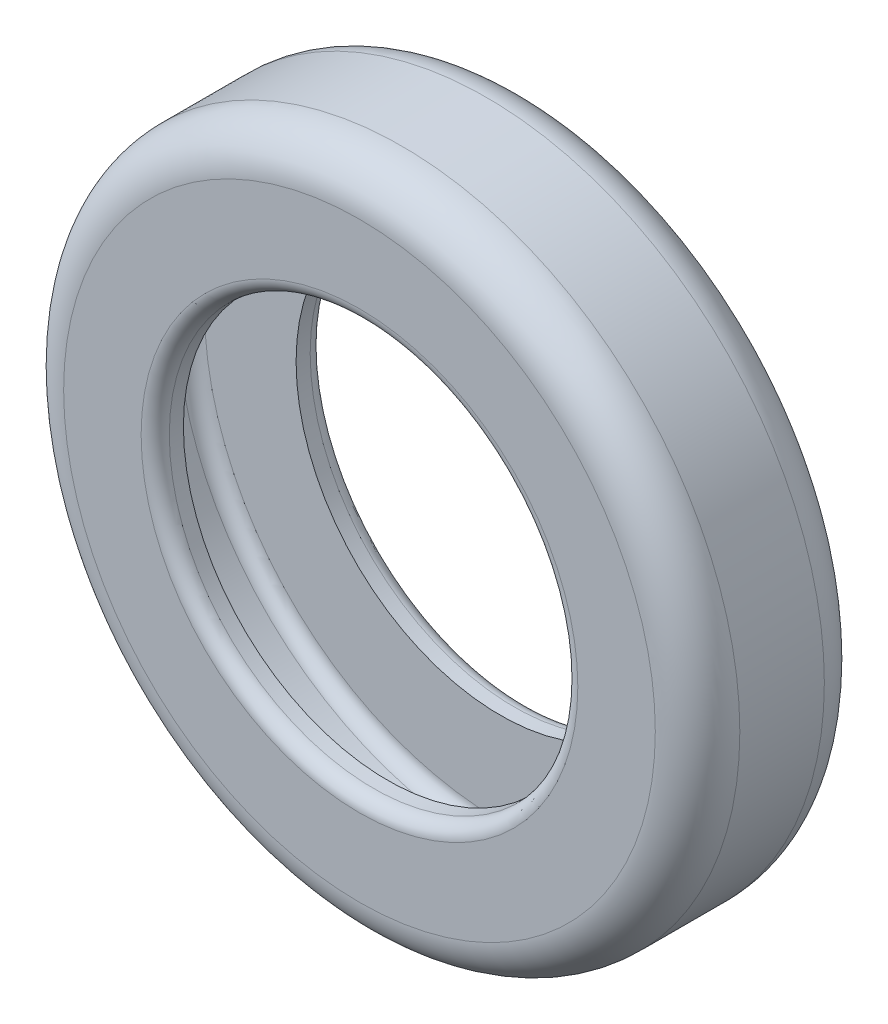
ISO-10303-21;
HEADER;
FILE_DESCRIPTION(('STEP AP214'),'2;1');
FILE_NAME('part.step','',(''),(''),'','','');
FILE_SCHEMA(('AUTOMOTIVE_DESIGN { 1 0 10303 214 1 1 1 1 }'));
ENDSEC;
DATA;
#1=APPLICATION_CONTEXT('core data for automotive mechanical design processes');
#2=APPLICATION_PROTOCOL_DEFINITION('international standard','automotive_design',2000,#1);
#3=PRODUCT_CONTEXT('',#1,'mechanical');
#4=PRODUCT('Part','Part','',(#3));
#5=PRODUCT_RELATED_PRODUCT_CATEGORY('part','',(#4));
#6=PRODUCT_DEFINITION_FORMATION('','',#4);
#7=PRODUCT_DEFINITION_CONTEXT('part definition',#1,'design');
#8=PRODUCT_DEFINITION('design','',#6,#7);
#9=PRODUCT_DEFINITION_SHAPE('','',#8);
#10=(LENGTH_UNIT() NAMED_UNIT(*) SI_UNIT(.MILLI.,.METRE.));
#11=(NAMED_UNIT(*) PLANE_ANGLE_UNIT() SI_UNIT($,.RADIAN.));
#12=(NAMED_UNIT(*) SI_UNIT($,.STERADIAN.) SOLID_ANGLE_UNIT());
#13=UNCERTAINTY_MEASURE_WITH_UNIT(LENGTH_MEASURE(1.E-05),#10,'distance_accuracy_value','');
#14=(GEOMETRIC_REPRESENTATION_CONTEXT(3) GLOBAL_UNCERTAINTY_ASSIGNED_CONTEXT((#13)) GLOBAL_UNIT_ASSIGNED_CONTEXT((#10,
#11,#12)) REPRESENTATION_CONTEXT('',''));
#15=CARTESIAN_POINT('',(0.,0.,0.));
#16=DIRECTION('',(0.,0.,1.));
#17=DIRECTION('',(1.,0.,0.));
#18=AXIS2_PLACEMENT_3D('',#15,#16,#17);
#19=CARTESIAN_POINT('',(0.,0.,-120.));
#20=DIRECTION('',(0.,0.,1.));
#21=DIRECTION('',(1.,0.,0.));
#22=AXIS2_PLACEMENT_3D('',#19,#20,#21);
#23=CYLINDRICAL_SURFACE('',#22,145.);
#24=CARTESIAN_POINT('',(0.,0.,-110.));
#25=DIRECTION('',(0.,0.,1.));
#26=DIRECTION('',(1.,0.,0.));
#27=AXIS2_PLACEMENT_3D('',#24,#25,#26);
#28=CIRCLE('',#27,145.);
#29=CARTESIAN_POINT('',(145.,0.,-110.));
#30=VERTEX_POINT('',#29);
#31=EDGE_CURVE('E11',#30,#30,#28,.F.);
#32=ORIENTED_EDGE('',*,*,#31,.T.);
#33=EDGE_LOOP('',(#32));
#34=FACE_BOUND('',#33,.T.);
#35=CARTESIAN_POINT('',(0.,0.,-100.));
#36=DIRECTION('',(0.,0.,1.));
#37=DIRECTION('',(1.,0.,0.));
#38=AXIS2_PLACEMENT_3D('',#35,#36,#37);
#39=CIRCLE('',#38,145.);
#40=CARTESIAN_POINT('',(145.,0.,-100.));
#41=VERTEX_POINT('',#40);
#42=EDGE_CURVE('E89',#41,#41,#39,.F.);
#43=ORIENTED_EDGE('',*,*,#42,.F.);
#44=EDGE_LOOP('',(#43));
#45=FACE_BOUND('',#44,.T.);
#46=ADVANCED_FACE('F45',(#34,#45),#23,.F.);
#47=CARTESIAN_POINT('',(0.,0.,-120.));
#48=DIRECTION('',(0.,0.,1.));
#49=DIRECTION('',(1.,0.,0.));
#50=AXIS2_PLACEMENT_3D('',#47,#48,#49);
#51=CYLINDRICAL_SURFACE('',#50,240.);
#52=CARTESIAN_POINT('',(0.,0.,-90.));
#53=DIRECTION('',(0.,0.,1.));
#54=DIRECTION('',(1.,0.,0.));
#55=AXIS2_PLACEMENT_3D('',#52,#53,#54);
#56=CIRCLE('',#55,240.);
#57=CARTESIAN_POINT('',(240.,0.,-90.));
#58=VERTEX_POINT('',#57);
#59=EDGE_CURVE('E77',#58,#58,#56,.T.);
#60=ORIENTED_EDGE('',*,*,#59,.T.);
#61=EDGE_LOOP('',(#60));
#62=FACE_BOUND('',#61,.T.);
#63=CARTESIAN_POINT('',(0.,0.,-30.));
#64=DIRECTION('',(0.,0.,1.));
#65=DIRECTION('',(1.,0.,0.));
#66=AXIS2_PLACEMENT_3D('',#63,#64,#65);
#67=CIRCLE('',#66,240.);
#68=CARTESIAN_POINT('',(240.,0.,-30.));
#69=VERTEX_POINT('',#68);
#70=EDGE_CURVE('E81',#69,#69,#67,.F.);
#71=ORIENTED_EDGE('',*,*,#70,.T.);
#72=EDGE_LOOP('',(#71));
#73=FACE_BOUND('',#72,.T.);
#74=ADVANCED_FACE('F152',(#62,#73),#51,.T.);
#75=CARTESIAN_POINT('',(0.,0.,-120.));
#76=DIRECTION('',(0.,0.,1.));
#77=DIRECTION('',(1.,0.,0.));
#78=AXIS2_PLACEMENT_3D('',#75,#76,#77);
#79=PLANE('',#78);
#80=CARTESIAN_POINT('',(0.,0.,-120.));
#81=DIRECTION('',(0.,0.,1.));
#82=DIRECTION('',(1.,0.,0.));
#83=AXIS2_PLACEMENT_3D('',#80,#81,#82);
#84=CIRCLE('',#83,155.);
#85=CARTESIAN_POINT('',(155.,0.,-120.));
#86=VERTEX_POINT('',#85);
#87=EDGE_CURVE('E53',#86,#86,#84,.T.);
#88=ORIENTED_EDGE('',*,*,#87,.T.);
#89=EDGE_LOOP('',(#88));
#90=FACE_BOUND('',#89,.T.);
#91=CARTESIAN_POINT('',(0.,0.,-120.));
#92=DIRECTION('',(0.,0.,1.));
#93=DIRECTION('',(1.,0.,0.));
#94=AXIS2_PLACEMENT_3D('',#91,#92,#93);
#95=CIRCLE('',#94,210.);
#96=CARTESIAN_POINT('',(210.,0.,-120.));
#97=VERTEX_POINT('',#96);
#98=EDGE_CURVE('E73',#97,#97,#95,.F.);
#99=ORIENTED_EDGE('',*,*,#98,.T.);
#100=EDGE_LOOP('',(#99));
#101=FACE_BOUND('',#100,.T.);
#102=ADVANCED_FACE('F156',(#90,#101),#79,.F.);
#103=CARTESIAN_POINT('',(0.,0.,0.));
#104=DIRECTION('',(0.,0.,1.));
#105=DIRECTION('',(1.,0.,0.));
#106=AXIS2_PLACEMENT_3D('',#103,#104,#105);
#107=PLANE('',#106);
#108=CARTESIAN_POINT('',(0.,0.,0.));
#109=DIRECTION('',(0.,0.,1.));
#110=DIRECTION('',(1.,0.,0.));
#111=AXIS2_PLACEMENT_3D('',#108,#109,#110);
#112=CIRCLE('',#111,155.);
#113=CARTESIAN_POINT('',(155.,0.,0.));
#114=VERTEX_POINT('',#113);
#115=EDGE_CURVE('E58',#114,#114,#112,.F.);
#116=ORIENTED_EDGE('',*,*,#115,.T.);
#117=EDGE_LOOP('',(#116));
#118=FACE_BOUND('',#117,.T.);
#119=CARTESIAN_POINT('',(0.,0.,0.));
#120=DIRECTION('',(0.,0.,1.));
#121=DIRECTION('',(1.,0.,0.));
#122=AXIS2_PLACEMENT_3D('',#119,#120,#121);
#123=CIRCLE('',#122,210.);
#124=CARTESIAN_POINT('',(210.,0.,0.));
#125=VERTEX_POINT('',#124);
#126=EDGE_CURVE('E69',#125,#125,#123,.T.);
#127=ORIENTED_EDGE('',*,*,#126,.T.);
#128=EDGE_LOOP('',(#127));
#129=FACE_BOUND('',#128,.T.);
#130=ADVANCED_FACE('F135',(#118,#129),#107,.T.);
#131=CARTESIAN_POINT('',(0.,0.,-20.));
#132=DIRECTION('',(0.,0.,1.));
#133=DIRECTION('',(1.,0.,0.));
#134=AXIS2_PLACEMENT_3D('',#131,#132,#133);
#135=CIRCLE('',#134,145.);
#136=CARTESIAN_POINT('',(145.,0.,-20.));
#137=VERTEX_POINT('',#136);
#138=EDGE_CURVE('E85',#137,#137,#135,.F.);
#139=ORIENTED_EDGE('',*,*,#138,.T.);
#140=EDGE_LOOP('',(#139));
#141=FACE_BOUND('',#140,.T.);
#142=CARTESIAN_POINT('',(0.,0.,-9.99999999999999));
#143=DIRECTION('',(0.,0.,1.));
#144=DIRECTION('',(1.,0.,0.));
#145=AXIS2_PLACEMENT_3D('',#142,#143,#144);
#146=CIRCLE('',#145,145.);
#147=CARTESIAN_POINT('',(145.,0.,-9.99999999999999));
#148=VERTEX_POINT('',#147);
#149=EDGE_CURVE('E63',#148,#148,#146,.T.);
#150=ORIENTED_EDGE('',*,*,#149,.T.);
#151=EDGE_LOOP('',(#150));
#152=FACE_BOUND('',#151,.T.);
#153=ADVANCED_FACE('F131',(#141,#152),#23,.F.);
#154=CARTESIAN_POINT('',(0.,0.,-90.));
#155=DIRECTION('',(0.,0.,1.));
#156=DIRECTION('',(1.,0.,0.));
#157=AXIS2_PLACEMENT_3D('',#154,#155,#156);
#158=TOROIDAL_SURFACE('',#157,210.,30.);
#159=ORIENTED_EDGE('',*,*,#98,.F.);
#160=EDGE_LOOP('',(#159));
#161=FACE_BOUND('',#160,.T.);
#162=ORIENTED_EDGE('',*,*,#59,.F.);
#163=EDGE_LOOP('',(#162));
#164=FACE_BOUND('',#163,.T.);
#165=ADVANCED_FACE('F134',(#161,#164),#158,.T.);
#166=CARTESIAN_POINT('',(0.,0.,-30.));
#167=DIRECTION('',(0.,0.,1.));
#168=DIRECTION('',(1.,0.,0.));
#169=AXIS2_PLACEMENT_3D('',#166,#167,#168);
#170=TOROIDAL_SURFACE('',#169,210.,30.);
#171=ORIENTED_EDGE('',*,*,#70,.F.);
#172=EDGE_LOOP('',(#171));
#173=FACE_BOUND('',#172,.T.);
#174=ORIENTED_EDGE('',*,*,#126,.F.);
#175=EDGE_LOOP('',(#174));
#176=FACE_BOUND('',#175,.T.);
#177=ADVANCED_FACE('F141',(#173,#176),#170,.T.);
#178=CARTESIAN_POINT('',(0.,0.,-9.99999999999999));
#179=DIRECTION('',(0.,0.,1.));
#180=DIRECTION('',(1.,0.,0.));
#181=AXIS2_PLACEMENT_3D('',#178,#179,#180);
#182=TOROIDAL_SURFACE('',#181,155.,10.);
#183=ORIENTED_EDGE('',*,*,#115,.F.);
#184=EDGE_LOOP('',(#183));
#185=FACE_BOUND('',#184,.T.);
#186=ORIENTED_EDGE('',*,*,#149,.F.);
#187=EDGE_LOOP('',(#186));
#188=FACE_BOUND('',#187,.T.);
#189=ADVANCED_FACE('F139',(#185,#188),#182,.T.);
#190=CARTESIAN_POINT('',(0.,0.,-110.));
#191=DIRECTION('',(0.,0.,1.));
#192=DIRECTION('',(1.,0.,0.));
#193=AXIS2_PLACEMENT_3D('',#190,#191,#192);
#194=TOROIDAL_SURFACE('',#193,155.,10.);
#195=ORIENTED_EDGE('',*,*,#31,.F.);
#196=EDGE_LOOP('',(#195));
#197=FACE_BOUND('',#196,.T.);
#198=ORIENTED_EDGE('',*,*,#87,.F.);
#199=EDGE_LOOP('',(#198));
#200=FACE_BOUND('',#199,.T.);
#201=ADVANCED_FACE('F47',(#197,#200),#194,.T.);
#202=CARTESIAN_POINT('',(0.,0.,-120.));
#203=DIRECTION('',(0.,0.,1.));
#204=DIRECTION('',(1.,0.,0.));
#205=AXIS2_PLACEMENT_3D('',#202,#203,#204);
#206=CYLINDRICAL_SURFACE('',#205,220.);
#207=CARTESIAN_POINT('',(0.,0.,-90.));
#208=DIRECTION('',(0.,0.,1.));
#209=DIRECTION('',(1.,0.,0.));
#210=AXIS2_PLACEMENT_3D('',#207,#208,#209);
#211=CIRCLE('',#210,220.);
#212=CARTESIAN_POINT('',(220.,0.,-90.));
#213=VERTEX_POINT('',#212);
#214=EDGE_CURVE('E101',#213,#213,#211,.T.);
#215=ORIENTED_EDGE('',*,*,#214,.F.);
#216=EDGE_LOOP('',(#215));
#217=FACE_BOUND('',#216,.T.);
#218=CARTESIAN_POINT('',(0.,0.,-30.));
#219=DIRECTION('',(0.,0.,1.));
#220=DIRECTION('',(1.,0.,0.));
#221=AXIS2_PLACEMENT_3D('',#218,#219,#220);
#222=CIRCLE('',#221,220.);
#223=CARTESIAN_POINT('',(220.,0.,-30.));
#224=VERTEX_POINT('',#223);
#225=EDGE_CURVE('E102',#224,#224,#222,.F.);
#226=ORIENTED_EDGE('',*,*,#225,.F.);
#227=EDGE_LOOP('',(#226));
#228=FACE_BOUND('',#227,.T.);
#229=ADVANCED_FACE('F112',(#217,#228),#206,.F.);
#230=CARTESIAN_POINT('',(0.,0.,-100.));
#231=DIRECTION('',(0.,0.,1.));
#232=DIRECTION('',(1.,0.,0.));
#233=AXIS2_PLACEMENT_3D('',#230,#231,#232);
#234=PLANE('',#233);
#235=CARTESIAN_POINT('',(0.,0.,-100.));
#236=DIRECTION('',(0.,0.,1.));
#237=DIRECTION('',(1.,0.,0.));
#238=AXIS2_PLACEMENT_3D('',#235,#236,#237);
#239=CIRCLE('',#238,210.);
#240=CARTESIAN_POINT('',(210.,0.,-100.));
#241=VERTEX_POINT('',#240);
#242=EDGE_CURVE('E97',#241,#241,#239,.F.);
#243=ORIENTED_EDGE('',*,*,#242,.F.);
#244=EDGE_LOOP('',(#243));
#245=FACE_BOUND('',#244,.T.);
#246=ORIENTED_EDGE('',*,*,#42,.T.);
#247=EDGE_LOOP('',(#246));
#248=FACE_BOUND('',#247,.T.);
#249=ADVANCED_FACE('F115',(#245,#248),#234,.T.);
#250=CARTESIAN_POINT('',(0.,0.,-20.));
#251=DIRECTION('',(0.,0.,1.));
#252=DIRECTION('',(1.,0.,0.));
#253=AXIS2_PLACEMENT_3D('',#250,#251,#252);
#254=PLANE('',#253);
#255=CARTESIAN_POINT('',(0.,0.,-20.));
#256=DIRECTION('',(0.,0.,1.));
#257=DIRECTION('',(1.,0.,0.));
#258=AXIS2_PLACEMENT_3D('',#255,#256,#257);
#259=CIRCLE('',#258,210.);
#260=CARTESIAN_POINT('',(210.,0.,-20.));
#261=VERTEX_POINT('',#260);
#262=EDGE_CURVE('E93',#261,#261,#259,.T.);
#263=ORIENTED_EDGE('',*,*,#262,.F.);
#264=EDGE_LOOP('',(#263));
#265=FACE_BOUND('',#264,.T.);
#266=ORIENTED_EDGE('',*,*,#138,.F.);
#267=EDGE_LOOP('',(#266));
#268=FACE_BOUND('',#267,.T.);
#269=ADVANCED_FACE('F125',(#265,#268),#254,.F.);
#270=CARTESIAN_POINT('',(0.,0.,-90.));
#271=DIRECTION('',(0.,0.,1.));
#272=DIRECTION('',(1.,0.,0.));
#273=AXIS2_PLACEMENT_3D('',#270,#271,#272);
#274=TOROIDAL_SURFACE('',#273,210.,10.);
#275=ORIENTED_EDGE('',*,*,#242,.T.);
#276=EDGE_LOOP('',(#275));
#277=FACE_BOUND('',#276,.T.);
#278=ORIENTED_EDGE('',*,*,#214,.T.);
#279=EDGE_LOOP('',(#278));
#280=FACE_BOUND('',#279,.T.);
#281=ADVANCED_FACE('F110',(#277,#280),#274,.F.);
#282=CARTESIAN_POINT('',(0.,0.,-30.));
#283=DIRECTION('',(0.,0.,1.));
#284=DIRECTION('',(1.,0.,0.));
#285=AXIS2_PLACEMENT_3D('',#282,#283,#284);
#286=TOROIDAL_SURFACE('',#285,210.,10.);
#287=ORIENTED_EDGE('',*,*,#225,.T.);
#288=EDGE_LOOP('',(#287));
#289=FACE_BOUND('',#288,.T.);
#290=ORIENTED_EDGE('',*,*,#262,.T.);
#291=EDGE_LOOP('',(#290));
#292=FACE_BOUND('',#291,.T.);
#293=ADVANCED_FACE('F119',(#289,#292),#286,.F.);
#294=CLOSED_SHELL('',(#46,#74,#102,#130,#153,#165,#177,#189,#201,#229,#249,#269,#281,#293));
#295=MANIFOLD_SOLID_BREP('B2',#294);
#296=ADVANCED_BREP_SHAPE_REPRESENTATION('',(#18,#295),#14);
#297=SHAPE_DEFINITION_REPRESENTATION(#9,#296);
ENDSEC;
END-ISO-10303-21;
